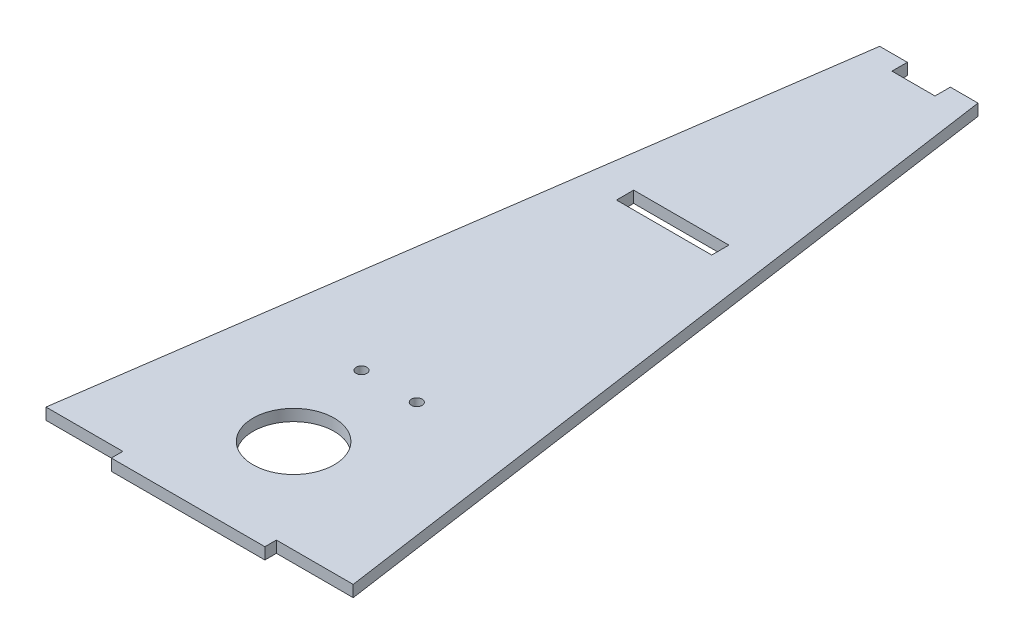
ISO-10303-21;
HEADER;
FILE_DESCRIPTION(('STEP AP214'),'2;1');
FILE_NAME('part.step','',(''),(''),'','','');
FILE_SCHEMA(('AUTOMOTIVE_DESIGN { 1 0 10303 214 1 1 1 1 }'));
ENDSEC;
DATA;
#1=APPLICATION_CONTEXT('core data for automotive mechanical design processes');
#2=APPLICATION_PROTOCOL_DEFINITION('international standard','automotive_design',2000,#1);
#3=PRODUCT_CONTEXT('',#1,'mechanical');
#4=PRODUCT('Part','Part','',(#3));
#5=PRODUCT_RELATED_PRODUCT_CATEGORY('part','',(#4));
#6=PRODUCT_DEFINITION_FORMATION('','',#4);
#7=PRODUCT_DEFINITION_CONTEXT('part definition',#1,'design');
#8=PRODUCT_DEFINITION('design','',#6,#7);
#9=PRODUCT_DEFINITION_SHAPE('','',#8);
#10=(LENGTH_UNIT() NAMED_UNIT(*) SI_UNIT(.MILLI.,.METRE.));
#11=(NAMED_UNIT(*) PLANE_ANGLE_UNIT() SI_UNIT($,.RADIAN.));
#12=(NAMED_UNIT(*) SI_UNIT($,.STERADIAN.) SOLID_ANGLE_UNIT());
#13=UNCERTAINTY_MEASURE_WITH_UNIT(LENGTH_MEASURE(1.E-05),#10,'distance_accuracy_value','');
#14=(GEOMETRIC_REPRESENTATION_CONTEXT(3) GLOBAL_UNCERTAINTY_ASSIGNED_CONTEXT((#13)) GLOBAL_UNIT_ASSIGNED_CONTEXT((#10,
#11,#12)) REPRESENTATION_CONTEXT('',''));
#15=CARTESIAN_POINT('',(0.,0.,0.));
#16=DIRECTION('',(0.,0.,1.));
#17=DIRECTION('',(1.,0.,0.));
#18=AXIS2_PLACEMENT_3D('',#15,#16,#17);
#19=CARTESIAN_POINT('',(63.5,4.7625,0.));
#20=DIRECTION('',(0.,0.,-1.));
#21=DIRECTION('',(-1.,0.,0.));
#22=AXIS2_PLACEMENT_3D('',#19,#20,#21);
#23=PLANE('',#22);
#24=DIRECTION('',(0.,1.,0.));
#25=VECTOR('',#24,1.);
#26=CARTESIAN_POINT('',(31.75,4.7625,0.));
#27=LINE('',#26,#25);
#28=CARTESIAN_POINT('',(31.75,0.,0.));
#29=VERTEX_POINT('',#28);
#30=CARTESIAN_POINT('',(31.75,4.7625,0.));
#31=VERTEX_POINT('',#30);
#32=EDGE_CURVE('E172',#29,#31,#27,.T.);
#33=ORIENTED_EDGE('',*,*,#32,.F.);
#34=DIRECTION('',(1.,0.,0.));
#35=VECTOR('',#34,1.);
#36=CARTESIAN_POINT('',(63.5,0.,0.));
#37=LINE('',#36,#35);
#38=CARTESIAN_POINT('',(63.5,0.,0.));
#39=VERTEX_POINT('',#38);
#40=EDGE_CURVE('E275',#29,#39,#37,.T.);
#41=ORIENTED_EDGE('',*,*,#40,.T.);
#42=DIRECTION('',(0.,-1.,0.));
#43=VECTOR('',#42,1.);
#44=CARTESIAN_POINT('',(63.5,4.7625,0.));
#45=LINE('',#44,#43);
#46=CARTESIAN_POINT('',(63.5,4.7625,0.));
#47=VERTEX_POINT('',#46);
#48=EDGE_CURVE('E266',#47,#39,#45,.T.);
#49=ORIENTED_EDGE('',*,*,#48,.F.);
#50=DIRECTION('',(1.,0.,0.));
#51=VECTOR('',#50,1.);
#52=CARTESIAN_POINT('',(63.5,4.7625,0.));
#53=LINE('',#52,#51);
#54=EDGE_CURVE('E51',#31,#47,#53,.T.);
#55=ORIENTED_EDGE('',*,*,#54,.F.);
#56=EDGE_LOOP('',(#33,#41,#49,#55));
#57=FACE_BOUND('',#56,.T.);
#58=ADVANCED_FACE('F36',(#57),#23,.F.);
#59=DIRECTION('',(0.,-1.,0.));
#60=VECTOR('',#59,1.);
#61=CARTESIAN_POINT('',(-31.75,4.7625,0.));
#62=LINE('',#61,#60);
#63=CARTESIAN_POINT('',(-31.75,4.7625,0.));
#64=VERTEX_POINT('',#63);
#65=CARTESIAN_POINT('',(-31.75,0.,0.));
#66=VERTEX_POINT('',#65);
#67=EDGE_CURVE('E59',#64,#66,#62,.T.);
#68=ORIENTED_EDGE('',*,*,#67,.F.);
#69=CARTESIAN_POINT('',(-63.5,4.7625,0.));
#70=VERTEX_POINT('',#69);
#71=EDGE_CURVE('E264',#70,#64,#53,.T.);
#72=ORIENTED_EDGE('',*,*,#71,.F.);
#73=DIRECTION('',(0.,-1.,0.));
#74=VECTOR('',#73,1.);
#75=CARTESIAN_POINT('',(-63.5,4.7625,0.));
#76=LINE('',#75,#74);
#77=CARTESIAN_POINT('',(-63.5,0.,0.));
#78=VERTEX_POINT('',#77);
#79=EDGE_CURVE('E279',#70,#78,#76,.T.);
#80=ORIENTED_EDGE('',*,*,#79,.T.);
#81=EDGE_CURVE('E259',#78,#66,#37,.T.);
#82=ORIENTED_EDGE('',*,*,#81,.T.);
#83=EDGE_LOOP('',(#68,#72,#80,#82));
#84=FACE_BOUND('',#83,.T.);
#85=ADVANCED_FACE('F296',(#84),#23,.F.);
#86=CARTESIAN_POINT('',(-20.3259946475863,4.7625,-301.470183231824));
#87=DIRECTION('',(0.,0.,1.));
#88=DIRECTION('',(1.,0.,0.));
#89=AXIS2_PLACEMENT_3D('',#86,#87,#88);
#90=PLANE('',#89);
#91=DIRECTION('',(-1.,0.,0.));
#92=VECTOR('',#91,1.);
#93=CARTESIAN_POINT('',(-20.3259946475863,0.,-301.470183231824));
#94=LINE('',#93,#92);
#95=CARTESIAN_POINT('',(20.3259946475863,0.,-301.470183231824));
#96=VERTEX_POINT('',#95);
#97=CARTESIAN_POINT('',(8.89,0.,-301.470183231824));
#98=VERTEX_POINT('',#97);
#99=EDGE_CURVE('E270',#96,#98,#94,.T.);
#100=ORIENTED_EDGE('',*,*,#99,.T.);
#101=DIRECTION('',(0.,1.,0.));
#102=VECTOR('',#101,1.);
#103=CARTESIAN_POINT('',(8.89,0.,-301.470183231824));
#104=LINE('',#103,#102);
#105=CARTESIAN_POINT('',(8.89,4.7625,-301.470183231824));
#106=VERTEX_POINT('',#105);
#107=EDGE_CURVE('E242',#98,#106,#104,.T.);
#108=ORIENTED_EDGE('',*,*,#107,.T.);
#109=DIRECTION('',(-1.,0.,0.));
#110=VECTOR('',#109,1.);
#111=CARTESIAN_POINT('',(-20.3259946475863,4.7625,-301.470183231824));
#112=LINE('',#111,#110);
#113=CARTESIAN_POINT('',(20.3259946475863,4.7625,-301.470183231824));
#114=VERTEX_POINT('',#113);
#115=EDGE_CURVE('E260',#114,#106,#112,.T.);
#116=ORIENTED_EDGE('',*,*,#115,.F.);
#117=DIRECTION('',(0.,-1.,0.));
#118=VECTOR('',#117,1.);
#119=CARTESIAN_POINT('',(20.3259946475863,4.7625,-301.470183231824));
#120=LINE('',#119,#118);
#121=EDGE_CURVE('E11',#114,#96,#120,.T.);
#122=ORIENTED_EDGE('',*,*,#121,.T.);
#123=EDGE_LOOP('',(#100,#108,#116,#122));
#124=FACE_BOUND('',#123,.T.);
#125=ADVANCED_FACE('F313',(#124),#90,.F.);
#126=CARTESIAN_POINT('',(63.5,4.7625,0.));
#127=DIRECTION('',(-0.989900321238251,0.,0.14176513680171));
#128=DIRECTION('',(0.14176513680171,0.,0.989900321238251));
#129=AXIS2_PLACEMENT_3D('',#126,#127,#128);
#130=PLANE('',#129);
#131=DIRECTION('',(-0.14176513680171,0.,-0.989900321238251));
#132=VECTOR('',#131,1.);
#133=CARTESIAN_POINT('',(63.5,0.,0.));
#134=LINE('',#133,#132);
#135=EDGE_CURVE('E184',#39,#96,#134,.T.);
#136=ORIENTED_EDGE('',*,*,#135,.T.);
#137=ORIENTED_EDGE('',*,*,#121,.F.);
#138=DIRECTION('',(-0.14176513680171,0.,-0.989900321238251));
#139=VECTOR('',#138,1.);
#140=CARTESIAN_POINT('',(63.5,4.7625,0.));
#141=LINE('',#140,#139);
#142=EDGE_CURVE('E255',#47,#114,#141,.T.);
#143=ORIENTED_EDGE('',*,*,#142,.F.);
#144=ORIENTED_EDGE('',*,*,#48,.T.);
#145=EDGE_LOOP('',(#136,#137,#143,#144));
#146=FACE_BOUND('',#145,.T.);
#147=ADVANCED_FACE('F38',(#146),#130,.F.);
#148=CARTESIAN_POINT('',(-8.89,4.7625,-301.470183231824));
#149=VERTEX_POINT('',#148);
#150=CARTESIAN_POINT('',(-20.3259946475863,4.7625,-301.470183231824));
#151=VERTEX_POINT('',#150);
#152=EDGE_CURVE('E258',#149,#151,#112,.T.);
#153=ORIENTED_EDGE('',*,*,#152,.F.);
#154=DIRECTION('',(0.,1.,0.));
#155=VECTOR('',#154,1.);
#156=CARTESIAN_POINT('',(-8.89,0.,-301.470183231824));
#157=LINE('',#156,#155);
#158=CARTESIAN_POINT('',(-8.89,0.,-301.470183231824));
#159=VERTEX_POINT('',#158);
#160=EDGE_CURVE('E251',#159,#149,#157,.T.);
#161=ORIENTED_EDGE('',*,*,#160,.F.);
#162=CARTESIAN_POINT('',(-20.3259946475863,0.,-301.470183231824));
#163=VERTEX_POINT('',#162);
#164=EDGE_CURVE('E269',#159,#163,#94,.T.);
#165=ORIENTED_EDGE('',*,*,#164,.T.);
#166=DIRECTION('',(0.,-1.,0.));
#167=VECTOR('',#166,1.);
#168=CARTESIAN_POINT('',(-20.3259946475863,4.7625,-301.470183231824));
#169=LINE('',#168,#167);
#170=EDGE_CURVE('E44',#151,#163,#169,.T.);
#171=ORIENTED_EDGE('',*,*,#170,.F.);
#172=EDGE_LOOP('',(#153,#161,#165,#171));
#173=FACE_BOUND('',#172,.T.);
#174=ADVANCED_FACE('F324',(#173),#90,.F.);
#175=CARTESIAN_POINT('',(-63.5,4.7625,0.));
#176=DIRECTION('',(0.989900321238251,0.,0.14176513680171));
#177=DIRECTION('',(0.14176513680171,0.,-0.989900321238251));
#178=AXIS2_PLACEMENT_3D('',#175,#176,#177);
#179=PLANE('',#178);
#180=DIRECTION('',(-0.14176513680171,0.,0.989900321238251));
#181=VECTOR('',#180,1.);
#182=CARTESIAN_POINT('',(-63.5,0.,0.));
#183=LINE('',#182,#181);
#184=EDGE_CURVE('E273',#163,#78,#183,.T.);
#185=ORIENTED_EDGE('',*,*,#184,.T.);
#186=ORIENTED_EDGE('',*,*,#79,.F.);
#187=DIRECTION('',(-0.14176513680171,0.,0.989900321238251));
#188=VECTOR('',#187,1.);
#189=CARTESIAN_POINT('',(-63.5,4.7625,0.));
#190=LINE('',#189,#188);
#191=EDGE_CURVE('E262',#151,#70,#190,.T.);
#192=ORIENTED_EDGE('',*,*,#191,.F.);
#193=ORIENTED_EDGE('',*,*,#170,.T.);
#194=EDGE_LOOP('',(#185,#186,#192,#193));
#195=FACE_BOUND('',#194,.T.);
#196=ADVANCED_FACE('F286',(#195),#179,.F.);
#197=CARTESIAN_POINT('',(0.,4.7625,0.));
#198=DIRECTION('',(0.,-1.,0.));
#199=DIRECTION('',(0.,0.,-1.));
#200=AXIS2_PLACEMENT_3D('',#197,#198,#199);
#201=PLANE('',#200);
#202=CARTESIAN_POINT('',(0.,4.7625,-38.862));
#203=DIRECTION('',(0.,1.,0.));
#204=DIRECTION('',(0.,0.,1.));
#205=AXIS2_PLACEMENT_3D('',#202,#203,#204);
#206=CIRCLE('',#205,16.764);
#207=CARTESIAN_POINT('',(0.,4.7625,-22.098));
#208=VERTEX_POINT('',#207);
#209=EDGE_CURVE('E185',#208,#208,#206,.T.);
#210=ORIENTED_EDGE('',*,*,#209,.F.);
#211=EDGE_LOOP('',(#210));
#212=FACE_BOUND('',#211,.T.);
#213=CARTESIAN_POINT('',(11.43,4.7625,-78.359));
#214=DIRECTION('',(0.,1.,0.));
#215=DIRECTION('',(0.,0.,-1.));
#216=AXIS2_PLACEMENT_3D('',#213,#214,#215);
#217=CIRCLE('',#216,2.2225);
#218=CARTESIAN_POINT('',(11.43,4.7625,-76.1365));
#219=VERTEX_POINT('',#218);
#220=EDGE_CURVE('E191',#219,#219,#217,.T.);
#221=ORIENTED_EDGE('',*,*,#220,.F.);
#222=EDGE_LOOP('',(#221));
#223=FACE_BOUND('',#222,.T.);
#224=CARTESIAN_POINT('',(-11.43,4.7625,-78.359));
#225=DIRECTION('',(0.,1.,0.));
#226=DIRECTION('',(0.,0.,1.));
#227=AXIS2_PLACEMENT_3D('',#224,#225,#226);
#228=CIRCLE('',#227,2.2225);
#229=CARTESIAN_POINT('',(-11.43,4.7625,-76.1365));
#230=VERTEX_POINT('',#229);
#231=EDGE_CURVE('E197',#230,#230,#228,.T.);
#232=ORIENTED_EDGE('',*,*,#231,.F.);
#233=EDGE_LOOP('',(#232));
#234=FACE_BOUND('',#233,.T.);
#235=DIRECTION('',(-1.,0.,0.));
#236=VECTOR('',#235,1.);
#237=CARTESIAN_POINT('',(-19.685,4.7625,-199.136));
#238=LINE('',#237,#236);
#239=CARTESIAN_POINT('',(19.685,4.7625,-199.136));
#240=VERTEX_POINT('',#239);
#241=CARTESIAN_POINT('',(-19.685,4.7625,-199.136));
#242=VERTEX_POINT('',#241);
#243=EDGE_CURVE('E217',#240,#242,#238,.T.);
#244=ORIENTED_EDGE('',*,*,#243,.F.);
#245=DIRECTION('',(0.,0.,-1.));
#246=VECTOR('',#245,1.);
#247=CARTESIAN_POINT('',(19.685,4.7625,-199.136));
#248=LINE('',#247,#246);
#249=CARTESIAN_POINT('',(19.685,4.7625,-192.024));
#250=VERTEX_POINT('',#249);
#251=EDGE_CURVE('E215',#250,#240,#248,.T.);
#252=ORIENTED_EDGE('',*,*,#251,.F.);
#253=DIRECTION('',(1.,0.,0.));
#254=VECTOR('',#253,1.);
#255=CARTESIAN_POINT('',(-19.685,4.7625,-192.024));
#256=LINE('',#255,#254);
#257=CARTESIAN_POINT('',(-19.685,4.7625,-192.024));
#258=VERTEX_POINT('',#257);
#259=EDGE_CURVE('E205',#258,#250,#256,.T.);
#260=ORIENTED_EDGE('',*,*,#259,.F.);
#261=DIRECTION('',(0.,0.,1.));
#262=VECTOR('',#261,1.);
#263=CARTESIAN_POINT('',(-19.685,4.7625,-199.136));
#264=LINE('',#263,#262);
#265=EDGE_CURVE('E221',#242,#258,#264,.T.);
#266=ORIENTED_EDGE('',*,*,#265,.F.);
#267=EDGE_LOOP('',(#244,#252,#260,#266));
#268=FACE_BOUND('',#267,.T.);
#269=ORIENTED_EDGE('',*,*,#115,.T.);
#270=DIRECTION('',(0.,0.,-1.));
#271=VECTOR('',#270,1.);
#272=CARTESIAN_POINT('',(8.89,4.7625,-301.470183231824));
#273=LINE('',#272,#271);
#274=CARTESIAN_POINT('',(8.89,4.7625,-295.120183231824));
#275=VERTEX_POINT('',#274);
#276=EDGE_CURVE('E173',#275,#106,#273,.T.);
#277=ORIENTED_EDGE('',*,*,#276,.F.);
#278=DIRECTION('',(1.,0.,0.));
#279=VECTOR('',#278,1.);
#280=CARTESIAN_POINT('',(-8.89,4.7625,-295.120183231824));
#281=LINE('',#280,#279);
#282=CARTESIAN_POINT('',(-8.89,4.7625,-295.120183231824));
#283=VERTEX_POINT('',#282);
#284=EDGE_CURVE('E237',#283,#275,#281,.T.);
#285=ORIENTED_EDGE('',*,*,#284,.F.);
#286=DIRECTION('',(0.,0.,1.));
#287=VECTOR('',#286,1.);
#288=CARTESIAN_POINT('',(-8.89,4.7625,-301.470183231824));
#289=LINE('',#288,#287);
#290=EDGE_CURVE('E175',#149,#283,#289,.T.);
#291=ORIENTED_EDGE('',*,*,#290,.F.);
#292=ORIENTED_EDGE('',*,*,#152,.T.);
#293=ORIENTED_EDGE('',*,*,#191,.T.);
#294=ORIENTED_EDGE('',*,*,#71,.T.);
#295=DIRECTION('',(0.,0.,-1.));
#296=VECTOR('',#295,1.);
#297=CARTESIAN_POINT('',(-31.75,4.7625,4.7625));
#298=LINE('',#297,#296);
#299=CARTESIAN_POINT('',(-31.75,4.7625,4.7625));
#300=VERTEX_POINT('',#299);
#301=EDGE_CURVE('E157',#300,#64,#298,.T.);
#302=ORIENTED_EDGE('',*,*,#301,.F.);
#303=DIRECTION('',(-1.,0.,0.));
#304=VECTOR('',#303,1.);
#305=CARTESIAN_POINT('',(-31.75,4.7625,4.7625));
#306=LINE('',#305,#304);
#307=CARTESIAN_POINT('',(31.75,4.7625,4.7625));
#308=VERTEX_POINT('',#307);
#309=EDGE_CURVE('E149',#308,#300,#306,.T.);
#310=ORIENTED_EDGE('',*,*,#309,.F.);
#311=DIRECTION('',(0.,0.,-1.));
#312=VECTOR('',#311,1.);
#313=CARTESIAN_POINT('',(31.75,4.7625,4.7625));
#314=LINE('',#313,#312);
#315=EDGE_CURVE('E154',#308,#31,#314,.T.);
#316=ORIENTED_EDGE('',*,*,#315,.T.);
#317=ORIENTED_EDGE('',*,*,#54,.T.);
#318=ORIENTED_EDGE('',*,*,#142,.T.);
#319=EDGE_LOOP('',(#269,#277,#285,#291,#292,#293,#294,#302,#310,#316,#317,#318));
#320=FACE_BOUND('',#319,.T.);
#321=ADVANCED_FACE('F152',(#212,#223,#234,#268,#320),#201,.F.);
#322=CARTESIAN_POINT('',(0.,0.,0.));
#323=DIRECTION('',(0.,-1.,0.));
#324=DIRECTION('',(0.,0.,-1.));
#325=AXIS2_PLACEMENT_3D('',#322,#323,#324);
#326=PLANE('',#325);
#327=CARTESIAN_POINT('',(0.,0.,-38.862));
#328=DIRECTION('',(0.,1.,0.));
#329=DIRECTION('',(0.,0.,1.));
#330=AXIS2_PLACEMENT_3D('',#327,#328,#329);
#331=CIRCLE('',#330,16.764);
#332=CARTESIAN_POINT('',(0.,0.,-22.098));
#333=VERTEX_POINT('',#332);
#334=EDGE_CURVE('E181',#333,#333,#331,.T.);
#335=ORIENTED_EDGE('',*,*,#334,.T.);
#336=EDGE_LOOP('',(#335));
#337=FACE_BOUND('',#336,.T.);
#338=CARTESIAN_POINT('',(11.43,0.,-78.359));
#339=DIRECTION('',(0.,1.,0.));
#340=DIRECTION('',(0.,0.,-1.));
#341=AXIS2_PLACEMENT_3D('',#338,#339,#340);
#342=CIRCLE('',#341,2.2225);
#343=CARTESIAN_POINT('',(11.43,0.,-76.1365));
#344=VERTEX_POINT('',#343);
#345=EDGE_CURVE('E188',#344,#344,#342,.T.);
#346=ORIENTED_EDGE('',*,*,#345,.T.);
#347=EDGE_LOOP('',(#346));
#348=FACE_BOUND('',#347,.T.);
#349=CARTESIAN_POINT('',(-11.43,0.,-78.359));
#350=DIRECTION('',(0.,1.,0.));
#351=DIRECTION('',(0.,0.,1.));
#352=AXIS2_PLACEMENT_3D('',#349,#350,#351);
#353=CIRCLE('',#352,2.2225);
#354=CARTESIAN_POINT('',(-11.43,0.,-76.1365));
#355=VERTEX_POINT('',#354);
#356=EDGE_CURVE('E194',#355,#355,#353,.T.);
#357=ORIENTED_EDGE('',*,*,#356,.T.);
#358=EDGE_LOOP('',(#357));
#359=FACE_BOUND('',#358,.T.);
#360=DIRECTION('',(0.,0.,-1.));
#361=VECTOR('',#360,1.);
#362=CARTESIAN_POINT('',(19.685,0.,-199.136));
#363=LINE('',#362,#361);
#364=CARTESIAN_POINT('',(19.685,0.,-192.024));
#365=VERTEX_POINT('',#364);
#366=CARTESIAN_POINT('',(19.685,0.,-199.136));
#367=VERTEX_POINT('',#366);
#368=EDGE_CURVE('E201',#365,#367,#363,.T.);
#369=ORIENTED_EDGE('',*,*,#368,.T.);
#370=DIRECTION('',(-1.,0.,0.));
#371=VECTOR('',#370,1.);
#372=CARTESIAN_POINT('',(-19.685,0.,-199.136));
#373=LINE('',#372,#371);
#374=CARTESIAN_POINT('',(-19.685,0.,-199.136));
#375=VERTEX_POINT('',#374);
#376=EDGE_CURVE('E204',#367,#375,#373,.T.);
#377=ORIENTED_EDGE('',*,*,#376,.T.);
#378=DIRECTION('',(0.,0.,1.));
#379=VECTOR('',#378,1.);
#380=CARTESIAN_POINT('',(-19.685,0.,-199.136));
#381=LINE('',#380,#379);
#382=CARTESIAN_POINT('',(-19.685,0.,-192.024));
#383=VERTEX_POINT('',#382);
#384=EDGE_CURVE('E208',#375,#383,#381,.T.);
#385=ORIENTED_EDGE('',*,*,#384,.T.);
#386=DIRECTION('',(1.,0.,0.));
#387=VECTOR('',#386,1.);
#388=CARTESIAN_POINT('',(-19.685,0.,-192.024));
#389=LINE('',#388,#387);
#390=EDGE_CURVE('E211',#383,#365,#389,.T.);
#391=ORIENTED_EDGE('',*,*,#390,.T.);
#392=EDGE_LOOP('',(#369,#377,#385,#391));
#393=FACE_BOUND('',#392,.T.);
#394=DIRECTION('',(0.,0.,-1.));
#395=VECTOR('',#394,1.);
#396=CARTESIAN_POINT('',(8.89,0.,-301.470183231824));
#397=LINE('',#396,#395);
#398=CARTESIAN_POINT('',(8.89,0.,-295.120183231824));
#399=VERTEX_POINT('',#398);
#400=EDGE_CURVE('E233',#399,#98,#397,.T.);
#401=ORIENTED_EDGE('',*,*,#400,.T.);
#402=ORIENTED_EDGE('',*,*,#99,.F.);
#403=ORIENTED_EDGE('',*,*,#135,.F.);
#404=ORIENTED_EDGE('',*,*,#40,.F.);
#405=DIRECTION('',(0.,0.,-1.));
#406=VECTOR('',#405,1.);
#407=CARTESIAN_POINT('',(31.75,0.,4.7625));
#408=LINE('',#407,#406);
#409=CARTESIAN_POINT('',(31.75,0.,4.7625));
#410=VERTEX_POINT('',#409);
#411=EDGE_CURVE('E303',#410,#29,#408,.T.);
#412=ORIENTED_EDGE('',*,*,#411,.F.);
#413=DIRECTION('',(1.,0.,0.));
#414=VECTOR('',#413,1.);
#415=CARTESIAN_POINT('',(-31.75,0.,4.7625));
#416=LINE('',#415,#414);
#417=CARTESIAN_POINT('',(-31.75,0.,4.7625));
#418=VERTEX_POINT('',#417);
#419=EDGE_CURVE('E166',#418,#410,#416,.T.);
#420=ORIENTED_EDGE('',*,*,#419,.F.);
#421=DIRECTION('',(0.,0.,-1.));
#422=VECTOR('',#421,1.);
#423=CARTESIAN_POINT('',(-31.75,0.,4.7625));
#424=LINE('',#423,#422);
#425=EDGE_CURVE('E177',#418,#66,#424,.T.);
#426=ORIENTED_EDGE('',*,*,#425,.T.);
#427=ORIENTED_EDGE('',*,*,#81,.F.);
#428=ORIENTED_EDGE('',*,*,#184,.F.);
#429=ORIENTED_EDGE('',*,*,#164,.F.);
#430=DIRECTION('',(0.,0.,1.));
#431=VECTOR('',#430,1.);
#432=CARTESIAN_POINT('',(-8.89,0.,-301.470183231824));
#433=LINE('',#432,#431);
#434=CARTESIAN_POINT('',(-8.89,0.,-295.120183231824));
#435=VERTEX_POINT('',#434);
#436=EDGE_CURVE('E236',#159,#435,#433,.T.);
#437=ORIENTED_EDGE('',*,*,#436,.T.);
#438=DIRECTION('',(1.,0.,0.));
#439=VECTOR('',#438,1.);
#440=CARTESIAN_POINT('',(-8.89,0.,-295.120183231824));
#441=LINE('',#440,#439);
#442=EDGE_CURVE('E240',#435,#399,#441,.T.);
#443=ORIENTED_EDGE('',*,*,#442,.T.);
#444=EDGE_LOOP('',(#401,#402,#403,#404,#412,#420,#426,#427,#428,#429,#437,#443));
#445=FACE_BOUND('',#444,.T.);
#446=ADVANCED_FACE('F293',(#337,#348,#359,#393,#445),#326,.T.);
#447=CARTESIAN_POINT('',(8.89,0.,-301.470183231824));
#448=DIRECTION('',(1.,0.,0.));
#449=DIRECTION('',(0.,0.,-1.));
#450=AXIS2_PLACEMENT_3D('',#447,#448,#449);
#451=PLANE('',#450);
#452=ORIENTED_EDGE('',*,*,#276,.T.);
#453=ORIENTED_EDGE('',*,*,#107,.F.);
#454=ORIENTED_EDGE('',*,*,#400,.F.);
#455=DIRECTION('',(0.,1.,0.));
#456=VECTOR('',#455,1.);
#457=CARTESIAN_POINT('',(8.89,0.,-295.120183231824));
#458=LINE('',#457,#456);
#459=EDGE_CURVE('E218',#399,#275,#458,.T.);
#460=ORIENTED_EDGE('',*,*,#459,.T.);
#461=EDGE_LOOP('',(#452,#453,#454,#460));
#462=FACE_BOUND('',#461,.T.);
#463=ADVANCED_FACE('F316',(#462),#451,.F.);
#464=CARTESIAN_POINT('',(-8.89,0.,-295.120183231824));
#465=DIRECTION('',(0.,0.,1.));
#466=DIRECTION('',(1.,0.,0.));
#467=AXIS2_PLACEMENT_3D('',#464,#465,#466);
#468=PLANE('',#467);
#469=ORIENTED_EDGE('',*,*,#284,.T.);
#470=ORIENTED_EDGE('',*,*,#459,.F.);
#471=ORIENTED_EDGE('',*,*,#442,.F.);
#472=DIRECTION('',(0.,1.,0.));
#473=VECTOR('',#472,1.);
#474=CARTESIAN_POINT('',(-8.89,0.,-295.120183231824));
#475=LINE('',#474,#473);
#476=EDGE_CURVE('E249',#435,#283,#475,.T.);
#477=ORIENTED_EDGE('',*,*,#476,.T.);
#478=EDGE_LOOP('',(#469,#470,#471,#477));
#479=FACE_BOUND('',#478,.T.);
#480=ADVANCED_FACE('F319',(#479),#468,.F.);
#481=CARTESIAN_POINT('',(-8.89,0.,-301.470183231824));
#482=DIRECTION('',(-1.,0.,0.));
#483=DIRECTION('',(0.,0.,1.));
#484=AXIS2_PLACEMENT_3D('',#481,#482,#483);
#485=PLANE('',#484);
#486=ORIENTED_EDGE('',*,*,#290,.T.);
#487=ORIENTED_EDGE('',*,*,#476,.F.);
#488=ORIENTED_EDGE('',*,*,#436,.F.);
#489=ORIENTED_EDGE('',*,*,#160,.T.);
#490=EDGE_LOOP('',(#486,#487,#488,#489));
#491=FACE_BOUND('',#490,.T.);
#492=ADVANCED_FACE('F321',(#491),#485,.F.);
#493=CARTESIAN_POINT('',(19.685,0.,-199.136));
#494=DIRECTION('',(1.,0.,0.));
#495=DIRECTION('',(0.,0.,-1.));
#496=AXIS2_PLACEMENT_3D('',#493,#494,#495);
#497=PLANE('',#496);
#498=ORIENTED_EDGE('',*,*,#251,.T.);
#499=DIRECTION('',(0.,1.,0.));
#500=VECTOR('',#499,1.);
#501=CARTESIAN_POINT('',(19.685,0.,-199.136));
#502=LINE('',#501,#500);
#503=EDGE_CURVE('E214',#367,#240,#502,.T.);
#504=ORIENTED_EDGE('',*,*,#503,.F.);
#505=ORIENTED_EDGE('',*,*,#368,.F.);
#506=DIRECTION('',(0.,1.,0.));
#507=VECTOR('',#506,1.);
#508=CARTESIAN_POINT('',(19.685,0.,-192.024));
#509=LINE('',#508,#507);
#510=EDGE_CURVE('E200',#365,#250,#509,.T.);
#511=ORIENTED_EDGE('',*,*,#510,.T.);
#512=EDGE_LOOP('',(#498,#504,#505,#511));
#513=FACE_BOUND('',#512,.T.);
#514=ADVANCED_FACE('F348',(#513),#497,.F.);
#515=CARTESIAN_POINT('',(-19.685,0.,-192.024));
#516=DIRECTION('',(0.,0.,1.));
#517=DIRECTION('',(1.,0.,0.));
#518=AXIS2_PLACEMENT_3D('',#515,#516,#517);
#519=PLANE('',#518);
#520=ORIENTED_EDGE('',*,*,#259,.T.);
#521=ORIENTED_EDGE('',*,*,#510,.F.);
#522=ORIENTED_EDGE('',*,*,#390,.F.);
#523=DIRECTION('',(0.,1.,0.));
#524=VECTOR('',#523,1.);
#525=CARTESIAN_POINT('',(-19.685,0.,-192.024));
#526=LINE('',#525,#524);
#527=EDGE_CURVE('E227',#383,#258,#526,.T.);
#528=ORIENTED_EDGE('',*,*,#527,.T.);
#529=EDGE_LOOP('',(#520,#521,#522,#528));
#530=FACE_BOUND('',#529,.T.);
#531=ADVANCED_FACE('F353',(#530),#519,.F.);
#532=CARTESIAN_POINT('',(-19.685,0.,-199.136));
#533=DIRECTION('',(-1.,0.,0.));
#534=DIRECTION('',(0.,0.,1.));
#535=AXIS2_PLACEMENT_3D('',#532,#533,#534);
#536=PLANE('',#535);
#537=ORIENTED_EDGE('',*,*,#265,.T.);
#538=ORIENTED_EDGE('',*,*,#527,.F.);
#539=ORIENTED_EDGE('',*,*,#384,.F.);
#540=DIRECTION('',(0.,1.,0.));
#541=VECTOR('',#540,1.);
#542=CARTESIAN_POINT('',(-19.685,0.,-199.136));
#543=LINE('',#542,#541);
#544=EDGE_CURVE('E229',#375,#242,#543,.T.);
#545=ORIENTED_EDGE('',*,*,#544,.T.);
#546=EDGE_LOOP('',(#537,#538,#539,#545));
#547=FACE_BOUND('',#546,.T.);
#548=ADVANCED_FACE('F359',(#547),#536,.F.);
#549=CARTESIAN_POINT('',(-19.685,0.,-199.136));
#550=DIRECTION('',(0.,0.,-1.));
#551=DIRECTION('',(-1.,0.,0.));
#552=AXIS2_PLACEMENT_3D('',#549,#550,#551);
#553=PLANE('',#552);
#554=ORIENTED_EDGE('',*,*,#243,.T.);
#555=ORIENTED_EDGE('',*,*,#544,.F.);
#556=ORIENTED_EDGE('',*,*,#376,.F.);
#557=ORIENTED_EDGE('',*,*,#503,.T.);
#558=EDGE_LOOP('',(#554,#555,#556,#557));
#559=FACE_BOUND('',#558,.T.);
#560=ADVANCED_FACE('F355',(#559),#553,.F.);
#561=CARTESIAN_POINT('',(-11.43,0.,-78.359));
#562=DIRECTION('',(0.,1.,0.));
#563=DIRECTION('',(0.,0.,1.));
#564=AXIS2_PLACEMENT_3D('',#561,#562,#563);
#565=CYLINDRICAL_SURFACE('',#564,2.2225);
#566=CARTESIAN_POINT('',(-11.43,0.,-76.1365));
#567=CARTESIAN_POINT('',(-11.43,0.049609375,-76.1365));
#568=CARTESIAN_POINT('',(-11.43,0.09921875,-76.1365));
#569=CARTESIAN_POINT('',(-11.43,0.1984375,-76.1365));
#570=CARTESIAN_POINT('',(-11.43,0.248046875,-76.1365));
#571=CARTESIAN_POINT('',(-11.43,0.347265625,-76.1365));
#572=CARTESIAN_POINT('',(-11.43,0.396875,-76.1365));
#573=CARTESIAN_POINT('',(-11.43,0.49609375,-76.1365));
#574=CARTESIAN_POINT('',(-11.43,0.545703125,-76.1365));
#575=CARTESIAN_POINT('',(-11.43,0.644921875,-76.1365));
#576=CARTESIAN_POINT('',(-11.43,0.69453125,-76.1365));
#577=CARTESIAN_POINT('',(-11.43,0.79375,-76.1365));
#578=CARTESIAN_POINT('',(-11.43,0.843359375,-76.1365));
#579=CARTESIAN_POINT('',(-11.43,0.942578125,-76.1365));
#580=CARTESIAN_POINT('',(-11.43,0.9921875,-76.1365));
#581=CARTESIAN_POINT('',(-11.43,1.09140625,-76.1365));
#582=CARTESIAN_POINT('',(-11.43,1.141015625,-76.1365));
#583=CARTESIAN_POINT('',(-11.43,1.240234375,-76.1365));
#584=CARTESIAN_POINT('',(-11.43,1.28984375,-76.1365));
#585=CARTESIAN_POINT('',(-11.43,1.3890625,-76.1365));
#586=CARTESIAN_POINT('',(-11.43,1.438671875,-76.1365));
#587=CARTESIAN_POINT('',(-11.43,1.537890625,-76.1365));
#588=CARTESIAN_POINT('',(-11.43,1.5875,-76.1365));
#589=CARTESIAN_POINT('',(-11.43,1.68671875,-76.1365));
#590=CARTESIAN_POINT('',(-11.43,1.736328125,-76.1365));
#591=CARTESIAN_POINT('',(-11.43,1.835546875,-76.1365));
#592=CARTESIAN_POINT('',(-11.43,1.88515625,-76.1365));
#593=CARTESIAN_POINT('',(-11.43,1.984375,-76.1365));
#594=CARTESIAN_POINT('',(-11.43,2.033984375,-76.1365));
#595=CARTESIAN_POINT('',(-11.43,2.133203125,-76.1365));
#596=CARTESIAN_POINT('',(-11.43,2.1828125,-76.1365));
#597=CARTESIAN_POINT('',(-11.43,2.28203125,-76.1365));
#598=CARTESIAN_POINT('',(-11.43,2.331640625,-76.1365));
#599=CARTESIAN_POINT('',(-11.43,2.430859375,-76.1365));
#600=CARTESIAN_POINT('',(-11.43,2.48046875,-76.1365));
#601=CARTESIAN_POINT('',(-11.43,2.5796875,-76.1365));
#602=CARTESIAN_POINT('',(-11.43,2.629296875,-76.1365));
#603=CARTESIAN_POINT('',(-11.43,2.728515625,-76.1365));
#604=CARTESIAN_POINT('',(-11.43,2.778125,-76.1365));
#605=CARTESIAN_POINT('',(-11.43,2.87734375,-76.1365));
#606=CARTESIAN_POINT('',(-11.43,2.926953125,-76.1365));
#607=CARTESIAN_POINT('',(-11.43,3.026171875,-76.1365));
#608=CARTESIAN_POINT('',(-11.43,3.07578125,-76.1365));
#609=CARTESIAN_POINT('',(-11.43,3.175,-76.1365));
#610=CARTESIAN_POINT('',(-11.43,3.224609375,-76.1365));
#611=CARTESIAN_POINT('',(-11.43,3.323828125,-76.1365));
#612=CARTESIAN_POINT('',(-11.43,3.3734375,-76.1365));
#613=CARTESIAN_POINT('',(-11.43,3.47265625,-76.1365));
#614=CARTESIAN_POINT('',(-11.43,3.522265625,-76.1365));
#615=CARTESIAN_POINT('',(-11.43,3.621484375,-76.1365));
#616=CARTESIAN_POINT('',(-11.43,3.67109375,-76.1365));
#617=CARTESIAN_POINT('',(-11.43,3.7703125,-76.1365));
#618=CARTESIAN_POINT('',(-11.43,3.819921875,-76.1365));
#619=CARTESIAN_POINT('',(-11.43,3.919140625,-76.1365));
#620=CARTESIAN_POINT('',(-11.43,3.96875,-76.1365));
#621=CARTESIAN_POINT('',(-11.43,4.06796875,-76.1365));
#622=CARTESIAN_POINT('',(-11.43,4.117578125,-76.1365));
#623=CARTESIAN_POINT('',(-11.43,4.216796875,-76.1365));
#624=CARTESIAN_POINT('',(-11.43,4.26640625,-76.1365));
#625=CARTESIAN_POINT('',(-11.43,4.365625,-76.1365));
#626=CARTESIAN_POINT('',(-11.43,4.415234375,-76.1365));
#627=CARTESIAN_POINT('',(-11.43,4.514453125,-76.1365));
#628=CARTESIAN_POINT('',(-11.43,4.5640625,-76.1365));
#629=CARTESIAN_POINT('',(-11.43,4.66328125,-76.1365));
#630=CARTESIAN_POINT('',(-11.43,4.712890625,-76.1365));
#631=CARTESIAN_POINT('',(-11.43,4.7625,-76.1365));
#632=B_SPLINE_CURVE_WITH_KNOTS('',3,(#566,#567,#568,#569,#570,#571,#572,#573,#574,#575,#576,
#577,#578,#579,#580,#581,#582,#583,#584,#585,#586,#587,#588,#589,#590,#591,#592,#593,#594,#595,
#596,#597,#598,#599,#600,#601,#602,#603,#604,#605,#606,#607,#608,#609,#610,#611,#612,#613,#614,
#615,#616,#617,#618,#619,#620,#621,#622,#623,#624,#625,#626,#627,#628,#629,#630,#631),
.UNSPECIFIED.,.F.,.F.,(4,2,2,2,2,2,2,2,2,2,2,2,2,2,2,2,2,2,2,2,2,2,2,2,2,2,2,2,2,2,2,2,4),(0.,
0.148828125,0.29765625,0.446484375,0.5953125,0.744140625,0.89296875,1.041796875,1.190625,
1.339453125,1.48828125,1.637109375,1.7859375,1.934765625,2.08359375,2.232421875,2.38125,
2.530078125,2.67890625,2.827734375,2.9765625,3.125390625,3.27421875,3.423046875,3.571875,
3.720703125,3.86953125,4.018359375,4.1671875,4.316015625,4.46484375,4.613671875,4.7625),.UNSPECIFIED.);
#633=EDGE_CURVE('BSEAM358',#355,#230,#632,.T.);
#634=ORIENTED_EDGE('',*,*,#356,.F.);
#635=ORIENTED_EDGE('',*,*,#231,.T.);
#636=ORIENTED_EDGE('',*,*,#633,.T.);
#637=ORIENTED_EDGE('',*,*,#633,.F.);
#638=EDGE_LOOP('',(#634,#636,#635,#637));
#639=FACE_BOUND('',#638,.T.);
#640=ADVANCED_FACE('F358',(#639),#565,.F.);
#641=CARTESIAN_POINT('',(11.43,0.,-78.359));
#642=DIRECTION('',(0.,1.,0.));
#643=DIRECTION('',(0.,0.,1.));
#644=AXIS2_PLACEMENT_3D('',#641,#642,#643);
#645=CYLINDRICAL_SURFACE('',#644,2.2225);
#646=CARTESIAN_POINT('',(11.43,0.,-76.1365));
#647=CARTESIAN_POINT('',(11.43,0.049609375,-76.1365));
#648=CARTESIAN_POINT('',(11.43,0.09921875,-76.1365));
#649=CARTESIAN_POINT('',(11.43,0.1984375,-76.1365));
#650=CARTESIAN_POINT('',(11.43,0.248046875,-76.1365));
#651=CARTESIAN_POINT('',(11.43,0.347265625,-76.1365));
#652=CARTESIAN_POINT('',(11.43,0.396875,-76.1365));
#653=CARTESIAN_POINT('',(11.43,0.49609375,-76.1365));
#654=CARTESIAN_POINT('',(11.43,0.545703125,-76.1365));
#655=CARTESIAN_POINT('',(11.43,0.644921875,-76.1365));
#656=CARTESIAN_POINT('',(11.43,0.69453125,-76.1365));
#657=CARTESIAN_POINT('',(11.43,0.79375,-76.1365));
#658=CARTESIAN_POINT('',(11.43,0.843359375,-76.1365));
#659=CARTESIAN_POINT('',(11.43,0.942578125,-76.1365));
#660=CARTESIAN_POINT('',(11.43,0.9921875,-76.1365));
#661=CARTESIAN_POINT('',(11.43,1.09140625,-76.1365));
#662=CARTESIAN_POINT('',(11.43,1.141015625,-76.1365));
#663=CARTESIAN_POINT('',(11.43,1.240234375,-76.1365));
#664=CARTESIAN_POINT('',(11.43,1.28984375,-76.1365));
#665=CARTESIAN_POINT('',(11.43,1.3890625,-76.1365));
#666=CARTESIAN_POINT('',(11.43,1.438671875,-76.1365));
#667=CARTESIAN_POINT('',(11.43,1.537890625,-76.1365));
#668=CARTESIAN_POINT('',(11.43,1.5875,-76.1365));
#669=CARTESIAN_POINT('',(11.43,1.68671875,-76.1365));
#670=CARTESIAN_POINT('',(11.43,1.736328125,-76.1365));
#671=CARTESIAN_POINT('',(11.43,1.835546875,-76.1365));
#672=CARTESIAN_POINT('',(11.43,1.88515625,-76.1365));
#673=CARTESIAN_POINT('',(11.43,1.984375,-76.1365));
#674=CARTESIAN_POINT('',(11.43,2.033984375,-76.1365));
#675=CARTESIAN_POINT('',(11.43,2.133203125,-76.1365));
#676=CARTESIAN_POINT('',(11.43,2.1828125,-76.1365));
#677=CARTESIAN_POINT('',(11.43,2.28203125,-76.1365));
#678=CARTESIAN_POINT('',(11.43,2.331640625,-76.1365));
#679=CARTESIAN_POINT('',(11.43,2.430859375,-76.1365));
#680=CARTESIAN_POINT('',(11.43,2.48046875,-76.1365));
#681=CARTESIAN_POINT('',(11.43,2.5796875,-76.1365));
#682=CARTESIAN_POINT('',(11.43,2.629296875,-76.1365));
#683=CARTESIAN_POINT('',(11.43,2.728515625,-76.1365));
#684=CARTESIAN_POINT('',(11.43,2.778125,-76.1365));
#685=CARTESIAN_POINT('',(11.43,2.87734375,-76.1365));
#686=CARTESIAN_POINT('',(11.43,2.926953125,-76.1365));
#687=CARTESIAN_POINT('',(11.43,3.026171875,-76.1365));
#688=CARTESIAN_POINT('',(11.43,3.07578125,-76.1365));
#689=CARTESIAN_POINT('',(11.43,3.175,-76.1365));
#690=CARTESIAN_POINT('',(11.43,3.224609375,-76.1365));
#691=CARTESIAN_POINT('',(11.43,3.323828125,-76.1365));
#692=CARTESIAN_POINT('',(11.43,3.3734375,-76.1365));
#693=CARTESIAN_POINT('',(11.43,3.47265625,-76.1365));
#694=CARTESIAN_POINT('',(11.43,3.522265625,-76.1365));
#695=CARTESIAN_POINT('',(11.43,3.621484375,-76.1365));
#696=CARTESIAN_POINT('',(11.43,3.67109375,-76.1365));
#697=CARTESIAN_POINT('',(11.43,3.7703125,-76.1365));
#698=CARTESIAN_POINT('',(11.43,3.819921875,-76.1365));
#699=CARTESIAN_POINT('',(11.43,3.919140625,-76.1365));
#700=CARTESIAN_POINT('',(11.43,3.96875,-76.1365));
#701=CARTESIAN_POINT('',(11.43,4.06796875,-76.1365));
#702=CARTESIAN_POINT('',(11.43,4.117578125,-76.1365));
#703=CARTESIAN_POINT('',(11.43,4.216796875,-76.1365));
#704=CARTESIAN_POINT('',(11.43,4.26640625,-76.1365));
#705=CARTESIAN_POINT('',(11.43,4.365625,-76.1365));
#706=CARTESIAN_POINT('',(11.43,4.415234375,-76.1365));
#707=CARTESIAN_POINT('',(11.43,4.514453125,-76.1365));
#708=CARTESIAN_POINT('',(11.43,4.5640625,-76.1365));
#709=CARTESIAN_POINT('',(11.43,4.66328125,-76.1365));
#710=CARTESIAN_POINT('',(11.43,4.712890625,-76.1365));
#711=CARTESIAN_POINT('',(11.43,4.7625,-76.1365));
#712=B_SPLINE_CURVE_WITH_KNOTS('',3,(#646,#647,#648,#649,#650,#651,#652,#653,#654,#655,#656,
#657,#658,#659,#660,#661,#662,#663,#664,#665,#666,#667,#668,#669,#670,#671,#672,#673,#674,#675,
#676,#677,#678,#679,#680,#681,#682,#683,#684,#685,#686,#687,#688,#689,#690,#691,#692,#693,#694,
#695,#696,#697,#698,#699,#700,#701,#702,#703,#704,#705,#706,#707,#708,#709,#710,#711),
.UNSPECIFIED.,.F.,.F.,(4,2,2,2,2,2,2,2,2,2,2,2,2,2,2,2,2,2,2,2,2,2,2,2,2,2,2,2,2,2,2,2,4),(0.,
0.148828125,0.29765625,0.446484375,0.5953125,0.744140625,0.89296875,1.041796875,1.190625,
1.339453125,1.48828125,1.637109375,1.7859375,1.934765625,2.08359375,2.232421875,2.38125,
2.530078125,2.67890625,2.827734375,2.9765625,3.125390625,3.27421875,3.423046875,3.571875,
3.720703125,3.86953125,4.018359375,4.1671875,4.316015625,4.46484375,4.613671875,4.7625),.UNSPECIFIED.);
#713=EDGE_CURVE('BSEAM369',#344,#219,#712,.T.);
#714=ORIENTED_EDGE('',*,*,#345,.F.);
#715=ORIENTED_EDGE('',*,*,#220,.T.);
#716=ORIENTED_EDGE('',*,*,#713,.T.);
#717=ORIENTED_EDGE('',*,*,#713,.F.);
#718=EDGE_LOOP('',(#714,#716,#715,#717));
#719=FACE_BOUND('',#718,.T.);
#720=ADVANCED_FACE('F369',(#719),#645,.F.);
#721=CARTESIAN_POINT('',(0.,0.,-38.862));
#722=DIRECTION('',(0.,1.,0.));
#723=DIRECTION('',(0.,0.,1.));
#724=AXIS2_PLACEMENT_3D('',#721,#722,#723);
#725=CYLINDRICAL_SURFACE('',#724,16.764);
#726=CARTESIAN_POINT('',(0.,0.,-22.098));
#727=CARTESIAN_POINT('',(0.,0.049609375,-22.098));
#728=CARTESIAN_POINT('',(0.,0.09921875,-22.098));
#729=CARTESIAN_POINT('',(0.,0.1984375,-22.098));
#730=CARTESIAN_POINT('',(0.,0.248046875,-22.098));
#731=CARTESIAN_POINT('',(0.,0.347265625,-22.098));
#732=CARTESIAN_POINT('',(0.,0.396875,-22.098));
#733=CARTESIAN_POINT('',(0.,0.49609375,-22.098));
#734=CARTESIAN_POINT('',(0.,0.545703125,-22.098));
#735=CARTESIAN_POINT('',(0.,0.644921875,-22.098));
#736=CARTESIAN_POINT('',(0.,0.69453125,-22.098));
#737=CARTESIAN_POINT('',(0.,0.79375,-22.098));
#738=CARTESIAN_POINT('',(0.,0.843359375,-22.098));
#739=CARTESIAN_POINT('',(0.,0.942578125,-22.098));
#740=CARTESIAN_POINT('',(0.,0.9921875,-22.098));
#741=CARTESIAN_POINT('',(0.,1.09140625,-22.098));
#742=CARTESIAN_POINT('',(0.,1.141015625,-22.098));
#743=CARTESIAN_POINT('',(0.,1.240234375,-22.098));
#744=CARTESIAN_POINT('',(0.,1.28984375,-22.098));
#745=CARTESIAN_POINT('',(0.,1.3890625,-22.098));
#746=CARTESIAN_POINT('',(0.,1.438671875,-22.098));
#747=CARTESIAN_POINT('',(0.,1.537890625,-22.098));
#748=CARTESIAN_POINT('',(0.,1.5875,-22.098));
#749=CARTESIAN_POINT('',(0.,1.68671875,-22.098));
#750=CARTESIAN_POINT('',(0.,1.736328125,-22.098));
#751=CARTESIAN_POINT('',(0.,1.835546875,-22.098));
#752=CARTESIAN_POINT('',(0.,1.88515625,-22.098));
#753=CARTESIAN_POINT('',(0.,1.984375,-22.098));
#754=CARTESIAN_POINT('',(0.,2.033984375,-22.098));
#755=CARTESIAN_POINT('',(0.,2.133203125,-22.098));
#756=CARTESIAN_POINT('',(0.,2.1828125,-22.098));
#757=CARTESIAN_POINT('',(0.,2.28203125,-22.098));
#758=CARTESIAN_POINT('',(0.,2.331640625,-22.098));
#759=CARTESIAN_POINT('',(0.,2.430859375,-22.098));
#760=CARTESIAN_POINT('',(0.,2.48046875,-22.098));
#761=CARTESIAN_POINT('',(0.,2.5796875,-22.098));
#762=CARTESIAN_POINT('',(0.,2.629296875,-22.098));
#763=CARTESIAN_POINT('',(0.,2.728515625,-22.098));
#764=CARTESIAN_POINT('',(0.,2.778125,-22.098));
#765=CARTESIAN_POINT('',(0.,2.87734375,-22.098));
#766=CARTESIAN_POINT('',(0.,2.926953125,-22.098));
#767=CARTESIAN_POINT('',(0.,3.026171875,-22.098));
#768=CARTESIAN_POINT('',(0.,3.07578125,-22.098));
#769=CARTESIAN_POINT('',(0.,3.175,-22.098));
#770=CARTESIAN_POINT('',(0.,3.224609375,-22.098));
#771=CARTESIAN_POINT('',(0.,3.323828125,-22.098));
#772=CARTESIAN_POINT('',(0.,3.3734375,-22.098));
#773=CARTESIAN_POINT('',(0.,3.47265625,-22.098));
#774=CARTESIAN_POINT('',(0.,3.522265625,-22.098));
#775=CARTESIAN_POINT('',(0.,3.621484375,-22.098));
#776=CARTESIAN_POINT('',(0.,3.67109375,-22.098));
#777=CARTESIAN_POINT('',(0.,3.7703125,-22.098));
#778=CARTESIAN_POINT('',(0.,3.819921875,-22.098));
#779=CARTESIAN_POINT('',(0.,3.919140625,-22.098));
#780=CARTESIAN_POINT('',(0.,3.96875,-22.098));
#781=CARTESIAN_POINT('',(0.,4.06796875,-22.098));
#782=CARTESIAN_POINT('',(0.,4.117578125,-22.098));
#783=CARTESIAN_POINT('',(0.,4.216796875,-22.098));
#784=CARTESIAN_POINT('',(0.,4.26640625,-22.098));
#785=CARTESIAN_POINT('',(0.,4.365625,-22.098));
#786=CARTESIAN_POINT('',(0.,4.415234375,-22.098));
#787=CARTESIAN_POINT('',(0.,4.514453125,-22.098));
#788=CARTESIAN_POINT('',(0.,4.5640625,-22.098));
#789=CARTESIAN_POINT('',(0.,4.66328125,-22.098));
#790=CARTESIAN_POINT('',(0.,4.712890625,-22.098));
#791=CARTESIAN_POINT('',(0.,4.7625,-22.098));
#792=B_SPLINE_CURVE_WITH_KNOTS('',3,(#726,#727,#728,#729,#730,#731,#732,#733,#734,#735,#736,
#737,#738,#739,#740,#741,#742,#743,#744,#745,#746,#747,#748,#749,#750,#751,#752,#753,#754,#755,
#756,#757,#758,#759,#760,#761,#762,#763,#764,#765,#766,#767,#768,#769,#770,#771,#772,#773,#774,
#775,#776,#777,#778,#779,#780,#781,#782,#783,#784,#785,#786,#787,#788,#789,#790,#791),
.UNSPECIFIED.,.F.,.F.,(4,2,2,2,2,2,2,2,2,2,2,2,2,2,2,2,2,2,2,2,2,2,2,2,2,2,2,2,2,2,2,2,4),(0.,
0.148828125,0.29765625,0.446484375,0.5953125,0.744140625,0.89296875,1.041796875,1.190625,
1.339453125,1.48828125,1.637109375,1.7859375,1.934765625,2.08359375,2.232421875,2.38125,
2.530078125,2.67890625,2.827734375,2.9765625,3.125390625,3.27421875,3.423046875,3.571875,
3.720703125,3.86953125,4.018359375,4.1671875,4.316015625,4.46484375,4.613671875,4.7625),.UNSPECIFIED.);
#793=EDGE_CURVE('BSEAM373',#333,#208,#792,.T.);
#794=ORIENTED_EDGE('',*,*,#334,.F.);
#795=ORIENTED_EDGE('',*,*,#209,.T.);
#796=ORIENTED_EDGE('',*,*,#793,.T.);
#797=ORIENTED_EDGE('',*,*,#793,.F.);
#798=EDGE_LOOP('',(#794,#796,#795,#797));
#799=FACE_BOUND('',#798,.T.);
#800=ADVANCED_FACE('F373',(#799),#725,.F.);
#801=CARTESIAN_POINT('',(31.75,4.7625,4.7625));
#802=DIRECTION('',(-1.,0.,0.));
#803=DIRECTION('',(0.,-1.,0.));
#804=AXIS2_PLACEMENT_3D('',#801,#802,#803);
#805=PLANE('',#804);
#806=ORIENTED_EDGE('',*,*,#32,.T.);
#807=ORIENTED_EDGE('',*,*,#315,.F.);
#808=DIRECTION('',(0.,1.,0.));
#809=VECTOR('',#808,1.);
#810=CARTESIAN_POINT('',(31.75,4.7625,4.7625));
#811=LINE('',#810,#809);
#812=EDGE_CURVE('E161',#410,#308,#811,.T.);
#813=ORIENTED_EDGE('',*,*,#812,.F.);
#814=ORIENTED_EDGE('',*,*,#411,.T.);
#815=EDGE_LOOP('',(#806,#807,#813,#814));
#816=FACE_BOUND('',#815,.T.);
#817=ADVANCED_FACE('F171',(#816),#805,.F.);
#818=CARTESIAN_POINT('',(-31.75,4.7625,4.7625));
#819=DIRECTION('',(1.,0.,0.));
#820=DIRECTION('',(0.,1.,0.));
#821=AXIS2_PLACEMENT_3D('',#818,#819,#820);
#822=PLANE('',#821);
#823=ORIENTED_EDGE('',*,*,#67,.T.);
#824=ORIENTED_EDGE('',*,*,#425,.F.);
#825=DIRECTION('',(0.,-1.,0.));
#826=VECTOR('',#825,1.);
#827=CARTESIAN_POINT('',(-31.75,4.7625,4.7625));
#828=LINE('',#827,#826);
#829=EDGE_CURVE('E160',#300,#418,#828,.T.);
#830=ORIENTED_EDGE('',*,*,#829,.F.);
#831=ORIENTED_EDGE('',*,*,#301,.T.);
#832=EDGE_LOOP('',(#823,#824,#830,#831));
#833=FACE_BOUND('',#832,.T.);
#834=ADVANCED_FACE('F298',(#833),#822,.F.);
#835=CARTESIAN_POINT('',(0.,0.,4.7625));
#836=DIRECTION('',(0.,0.,1.));
#837=DIRECTION('',(1.,0.,0.));
#838=AXIS2_PLACEMENT_3D('',#835,#836,#837);
#839=PLANE('',#838);
#840=ORIENTED_EDGE('',*,*,#812,.T.);
#841=ORIENTED_EDGE('',*,*,#309,.T.);
#842=ORIENTED_EDGE('',*,*,#829,.T.);
#843=ORIENTED_EDGE('',*,*,#419,.T.);
#844=EDGE_LOOP('',(#840,#841,#842,#843));
#845=FACE_BOUND('',#844,.T.);
#846=ADVANCED_FACE('F164',(#845),#839,.T.);
#847=CLOSED_SHELL('',(#58,#85,#125,#147,#174,#196,#321,#446,#463,#480,#492,#514,#531,#548,#560,
#640,#720,#800,#817,#834,#846));
#848=MANIFOLD_SOLID_BREP('B2',#847);
#849=ADVANCED_BREP_SHAPE_REPRESENTATION('',(#18,#848),#14);
#850=SHAPE_DEFINITION_REPRESENTATION(#9,#849);
ENDSEC;
END-ISO-10303-21;
